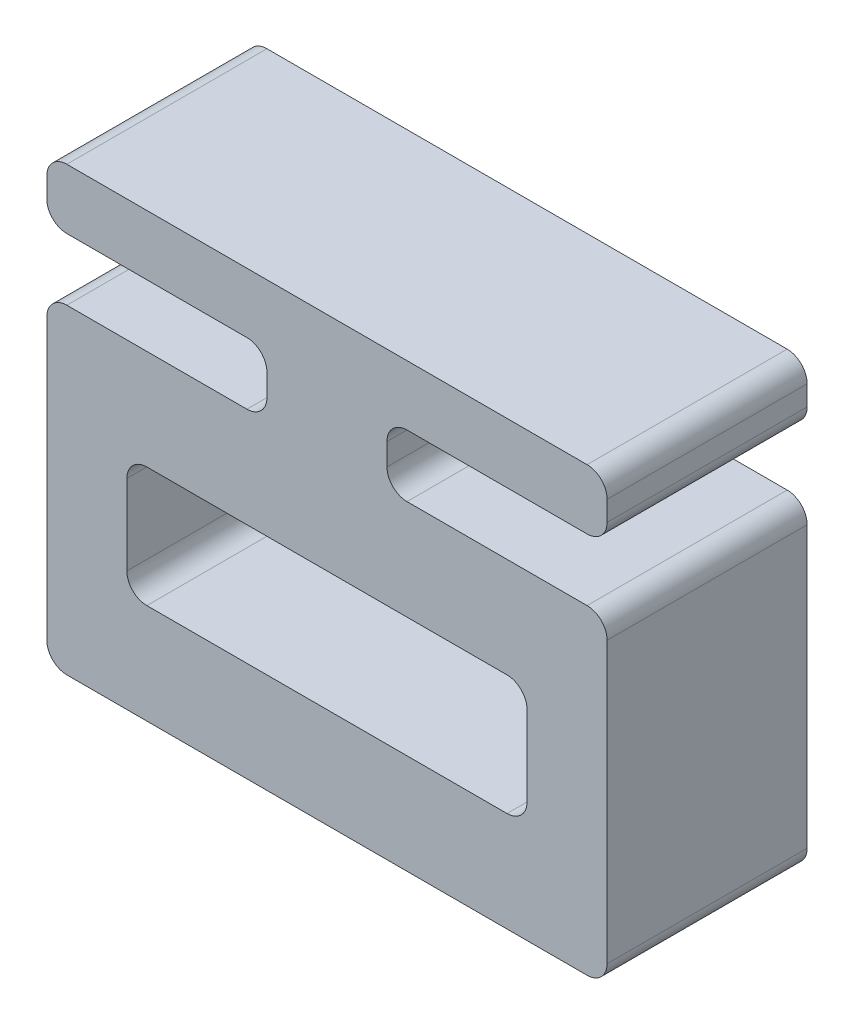
ISO-10303-21;
HEADER;
FILE_DESCRIPTION(('STEP AP214'),'2;1');
FILE_NAME('part.step','',(''),(''),'','','');
FILE_SCHEMA(('AUTOMOTIVE_DESIGN { 1 0 10303 214 1 1 1 1 }'));
ENDSEC;
DATA;
#1=APPLICATION_CONTEXT('core data for automotive mechanical design processes');
#2=APPLICATION_PROTOCOL_DEFINITION('international standard','automotive_design',2000,#1);
#3=PRODUCT_CONTEXT('',#1,'mechanical');
#4=PRODUCT('Part','Part','',(#3));
#5=PRODUCT_RELATED_PRODUCT_CATEGORY('part','',(#4));
#6=PRODUCT_DEFINITION_FORMATION('','',#4);
#7=PRODUCT_DEFINITION_CONTEXT('part definition',#1,'design');
#8=PRODUCT_DEFINITION('design','',#6,#7);
#9=PRODUCT_DEFINITION_SHAPE('','',#8);
#10=(LENGTH_UNIT() NAMED_UNIT(*) SI_UNIT(.MILLI.,.METRE.));
#11=(NAMED_UNIT(*) PLANE_ANGLE_UNIT() SI_UNIT($,.RADIAN.));
#12=(NAMED_UNIT(*) SI_UNIT($,.STERADIAN.) SOLID_ANGLE_UNIT());
#13=UNCERTAINTY_MEASURE_WITH_UNIT(LENGTH_MEASURE(1.E-05),#10,'distance_accuracy_value','');
#14=(GEOMETRIC_REPRESENTATION_CONTEXT(3) GLOBAL_UNCERTAINTY_ASSIGNED_CONTEXT((#13)) GLOBAL_UNIT_ASSIGNED_CONTEXT((#10,
#11,#12)) REPRESENTATION_CONTEXT('',''));
#15=CARTESIAN_POINT('',(0.,0.,0.));
#16=DIRECTION('',(0.,0.,1.));
#17=DIRECTION('',(1.,0.,0.));
#18=AXIS2_PLACEMENT_3D('',#15,#16,#17);
#19=CARTESIAN_POINT('',(0.,0.,5.));
#20=DIRECTION('',(0.,0.,-1.));
#21=DIRECTION('',(-1.,0.,0.));
#22=AXIS2_PLACEMENT_3D('',#19,#20,#21);
#23=PLANE('',#22);
#24=DIRECTION('',(0.,-1.,0.));
#25=VECTOR('',#24,1.);
#26=CARTESIAN_POINT('',(-7.,-4.,5.));
#27=LINE('',#26,#25);
#28=CARTESIAN_POINT('',(-7.,3.5,5.));
#29=VERTEX_POINT('',#28);
#30=CARTESIAN_POINT('',(-7.,-3.5,5.));
#31=VERTEX_POINT('',#30);
#32=EDGE_CURVE('E312',#29,#31,#27,.T.);
#33=ORIENTED_EDGE('',*,*,#32,.T.);
#34=CARTESIAN_POINT('',(-6.5,-3.5,5.));
#35=DIRECTION('',(0.,0.,-1.));
#36=DIRECTION('',(-1.,0.,0.));
#37=AXIS2_PLACEMENT_3D('',#34,#35,#36);
#38=CIRCLE('',#37,0.5);
#39=CARTESIAN_POINT('',(-6.5,-4.,5.));
#40=VERTEX_POINT('',#39);
#41=EDGE_CURVE('E351',#31,#40,#38,.F.);
#42=ORIENTED_EDGE('',*,*,#41,.T.);
#43=DIRECTION('',(1.,0.,0.));
#44=VECTOR('',#43,1.);
#45=CARTESIAN_POINT('',(-7.,-4.,5.));
#46=LINE('',#45,#44);
#47=CARTESIAN_POINT('',(6.5,-4.,5.));
#48=VERTEX_POINT('',#47);
#49=EDGE_CURVE('E269',#40,#48,#46,.T.);
#50=ORIENTED_EDGE('',*,*,#49,.T.);
#51=CARTESIAN_POINT('',(6.5,-3.5,5.));
#52=DIRECTION('',(0.,0.,-1.));
#53=DIRECTION('',(-1.,0.,0.));
#54=AXIS2_PLACEMENT_3D('',#51,#52,#53);
#55=CIRCLE('',#54,0.5);
#56=CARTESIAN_POINT('',(7.,-3.5,5.));
#57=VERTEX_POINT('',#56);
#58=EDGE_CURVE('E348',#48,#57,#55,.F.);
#59=ORIENTED_EDGE('',*,*,#58,.T.);
#60=DIRECTION('',(0.,1.,0.));
#61=VECTOR('',#60,1.);
#62=CARTESIAN_POINT('',(7.,-4.,5.));
#63=LINE('',#62,#61);
#64=CARTESIAN_POINT('',(7.,3.5,5.));
#65=VERTEX_POINT('',#64);
#66=EDGE_CURVE('E530',#57,#65,#63,.T.);
#67=ORIENTED_EDGE('',*,*,#66,.T.);
#68=CARTESIAN_POINT('',(6.5,3.5,5.));
#69=DIRECTION('',(0.,0.,-1.));
#70=DIRECTION('',(-1.,0.,0.));
#71=AXIS2_PLACEMENT_3D('',#68,#69,#70);
#72=CIRCLE('',#71,0.5);
#73=CARTESIAN_POINT('',(6.5,4.,5.));
#74=VERTEX_POINT('',#73);
#75=EDGE_CURVE('E330',#65,#74,#72,.F.);
#76=ORIENTED_EDGE('',*,*,#75,.T.);
#77=DIRECTION('',(-1.,0.,0.));
#78=VECTOR('',#77,1.);
#79=CARTESIAN_POINT('',(7.,4.,5.));
#80=LINE('',#79,#78);
#81=CARTESIAN_POINT('',(2.,4.,5.));
#82=VERTEX_POINT('',#81);
#83=EDGE_CURVE('E445',#74,#82,#80,.T.);
#84=ORIENTED_EDGE('',*,*,#83,.T.);
#85=CARTESIAN_POINT('',(2.,4.5,5.));
#86=DIRECTION('',(0.,0.,-1.));
#87=DIRECTION('',(-1.,0.,0.));
#88=AXIS2_PLACEMENT_3D('',#85,#86,#87);
#89=CIRCLE('',#88,0.5);
#90=CARTESIAN_POINT('',(1.5,4.5,5.));
#91=VERTEX_POINT('',#90);
#92=EDGE_CURVE('E425',#82,#91,#89,.T.);
#93=ORIENTED_EDGE('',*,*,#92,.T.);
#94=DIRECTION('',(0.,1.,0.));
#95=VECTOR('',#94,1.);
#96=CARTESIAN_POINT('',(1.5,5.55,5.));
#97=LINE('',#96,#95);
#98=CARTESIAN_POINT('',(1.5,5.05,5.));
#99=VERTEX_POINT('',#98);
#100=EDGE_CURVE('E439',#91,#99,#97,.T.);
#101=ORIENTED_EDGE('',*,*,#100,.T.);
#102=CARTESIAN_POINT('',(2.,5.05,5.));
#103=DIRECTION('',(0.,0.,-1.));
#104=DIRECTION('',(-1.,0.,0.));
#105=AXIS2_PLACEMENT_3D('',#102,#103,#104);
#106=CIRCLE('',#105,0.5);
#107=CARTESIAN_POINT('',(2.,5.55,5.));
#108=VERTEX_POINT('',#107);
#109=EDGE_CURVE('E563',#99,#108,#106,.T.);
#110=ORIENTED_EDGE('',*,*,#109,.T.);
#111=DIRECTION('',(1.,0.,0.));
#112=VECTOR('',#111,1.);
#113=CARTESIAN_POINT('',(7.,5.55,5.));
#114=LINE('',#113,#112);
#115=CARTESIAN_POINT('',(6.5,5.55,5.));
#116=VERTEX_POINT('',#115);
#117=EDGE_CURVE('E444',#108,#116,#114,.T.);
#118=ORIENTED_EDGE('',*,*,#117,.T.);
#119=CARTESIAN_POINT('',(6.5,6.05,5.));
#120=DIRECTION('',(0.,0.,-1.));
#121=DIRECTION('',(-1.,0.,0.));
#122=AXIS2_PLACEMENT_3D('',#119,#120,#121);
#123=CIRCLE('',#122,0.5);
#124=CARTESIAN_POINT('',(7.,6.05,5.));
#125=VERTEX_POINT('',#124);
#126=EDGE_CURVE('E339',#116,#125,#123,.F.);
#127=ORIENTED_EDGE('',*,*,#126,.T.);
#128=DIRECTION('',(0.,1.,0.));
#129=VECTOR('',#128,1.);
#130=CARTESIAN_POINT('',(7.,5.55,5.));
#131=LINE('',#130,#129);
#132=CARTESIAN_POINT('',(7.,6.55,5.));
#133=VERTEX_POINT('',#132);
#134=EDGE_CURVE('E452',#125,#133,#131,.T.);
#135=ORIENTED_EDGE('',*,*,#134,.T.);
#136=CARTESIAN_POINT('',(6.5,6.55,5.));
#137=DIRECTION('',(0.,0.,-1.));
#138=DIRECTION('',(-1.,0.,0.));
#139=AXIS2_PLACEMENT_3D('',#136,#137,#138);
#140=CIRCLE('',#139,0.5);
#141=CARTESIAN_POINT('',(6.5,7.05,5.));
#142=VERTEX_POINT('',#141);
#143=EDGE_CURVE('E342',#133,#142,#140,.F.);
#144=ORIENTED_EDGE('',*,*,#143,.T.);
#145=DIRECTION('',(-1.,0.,0.));
#146=VECTOR('',#145,1.);
#147=CARTESIAN_POINT('',(-7.,7.05,5.));
#148=LINE('',#147,#146);
#149=CARTESIAN_POINT('',(-6.5,7.05,5.));
#150=VERTEX_POINT('',#149);
#151=EDGE_CURVE('E460',#142,#150,#148,.T.);
#152=ORIENTED_EDGE('',*,*,#151,.T.);
#153=CARTESIAN_POINT('',(-6.5,6.55,5.));
#154=DIRECTION('',(0.,0.,-1.));
#155=DIRECTION('',(-1.,0.,0.));
#156=AXIS2_PLACEMENT_3D('',#153,#154,#155);
#157=CIRCLE('',#156,0.5);
#158=CARTESIAN_POINT('',(-7.,6.55,5.));
#159=VERTEX_POINT('',#158);
#160=EDGE_CURVE('E345',#150,#159,#157,.F.);
#161=ORIENTED_EDGE('',*,*,#160,.T.);
#162=DIRECTION('',(0.,-1.,0.));
#163=VECTOR('',#162,1.);
#164=CARTESIAN_POINT('',(-7.,5.55,5.));
#165=LINE('',#164,#163);
#166=CARTESIAN_POINT('',(-7.,6.05,5.));
#167=VERTEX_POINT('',#166);
#168=EDGE_CURVE('E464',#159,#167,#165,.T.);
#169=ORIENTED_EDGE('',*,*,#168,.T.);
#170=CARTESIAN_POINT('',(-6.5,6.05,5.));
#171=DIRECTION('',(0.,0.,-1.));
#172=DIRECTION('',(-1.,0.,0.));
#173=AXIS2_PLACEMENT_3D('',#170,#171,#172);
#174=CIRCLE('',#173,0.5);
#175=CARTESIAN_POINT('',(-6.5,5.55,5.));
#176=VERTEX_POINT('',#175);
#177=EDGE_CURVE('E336',#167,#176,#174,.F.);
#178=ORIENTED_EDGE('',*,*,#177,.T.);
#179=DIRECTION('',(1.,0.,0.));
#180=VECTOR('',#179,1.);
#181=CARTESIAN_POINT('',(-7.,5.55,5.));
#182=LINE('',#181,#180);
#183=CARTESIAN_POINT('',(-2.,5.55,5.));
#184=VERTEX_POINT('',#183);
#185=EDGE_CURVE('E469',#176,#184,#182,.T.);
#186=ORIENTED_EDGE('',*,*,#185,.T.);
#187=CARTESIAN_POINT('',(-2.,5.05,5.));
#188=DIRECTION('',(0.,0.,-1.));
#189=DIRECTION('',(-1.,0.,0.));
#190=AXIS2_PLACEMENT_3D('',#187,#188,#189);
#191=CIRCLE('',#190,0.5);
#192=CARTESIAN_POINT('',(-1.5,5.05,5.));
#193=VERTEX_POINT('',#192);
#194=EDGE_CURVE('E480',#184,#193,#191,.T.);
#195=ORIENTED_EDGE('',*,*,#194,.T.);
#196=DIRECTION('',(0.,-1.,0.));
#197=VECTOR('',#196,1.);
#198=CARTESIAN_POINT('',(-1.5,5.55,5.));
#199=LINE('',#198,#197);
#200=CARTESIAN_POINT('',(-1.5,4.5,5.));
#201=VERTEX_POINT('',#200);
#202=EDGE_CURVE('E474',#193,#201,#199,.T.);
#203=ORIENTED_EDGE('',*,*,#202,.T.);
#204=CARTESIAN_POINT('',(-2.,4.5,5.));
#205=DIRECTION('',(0.,0.,-1.));
#206=DIRECTION('',(-1.,0.,0.));
#207=AXIS2_PLACEMENT_3D('',#204,#205,#206);
#208=CIRCLE('',#207,0.5);
#209=CARTESIAN_POINT('',(-2.,4.,5.));
#210=VERTEX_POINT('',#209);
#211=EDGE_CURVE('E488',#201,#210,#208,.T.);
#212=ORIENTED_EDGE('',*,*,#211,.T.);
#213=DIRECTION('',(-1.,0.,0.));
#214=VECTOR('',#213,1.);
#215=CARTESIAN_POINT('',(-7.,4.,5.));
#216=LINE('',#215,#214);
#217=CARTESIAN_POINT('',(-6.5,4.,5.));
#218=VERTEX_POINT('',#217);
#219=EDGE_CURVE('E313',#210,#218,#216,.T.);
#220=ORIENTED_EDGE('',*,*,#219,.T.);
#221=CARTESIAN_POINT('',(-6.5,3.5,5.));
#222=DIRECTION('',(0.,0.,-1.));
#223=DIRECTION('',(-1.,0.,0.));
#224=AXIS2_PLACEMENT_3D('',#221,#222,#223);
#225=CIRCLE('',#224,0.5);
#226=EDGE_CURVE('E333',#218,#29,#225,.F.);
#227=ORIENTED_EDGE('',*,*,#226,.T.);
#228=EDGE_LOOP('',(#33,#42,#50,#59,#67,#76,#84,#93,#101,#110,#118,#127,#135,#144,#152,#161,#169,
#178,#186,#195,#203,#212,#220,#227));
#229=FACE_BOUND('',#228,.T.);
#230=DIRECTION('',(0.,-1.,0.));
#231=VECTOR('',#230,1.);
#232=CARTESIAN_POINT('',(-5.,-1.5,5.));
#233=LINE('',#232,#231);
#234=CARTESIAN_POINT('',(-5.,1.,5.));
#235=VERTEX_POINT('',#234);
#236=CARTESIAN_POINT('',(-5.,-1.,5.));
#237=VERTEX_POINT('',#236);
#238=EDGE_CURVE('E618',#235,#237,#233,.T.);
#239=ORIENTED_EDGE('',*,*,#238,.F.);
#240=CARTESIAN_POINT('',(-4.5,1.,5.));
#241=DIRECTION('',(0.,0.,-1.));
#242=DIRECTION('',(-1.,0.,0.));
#243=AXIS2_PLACEMENT_3D('',#240,#241,#242);
#244=CIRCLE('',#243,0.5);
#245=CARTESIAN_POINT('',(-4.5,1.5,5.));
#246=VERTEX_POINT('',#245);
#247=EDGE_CURVE('E632',#235,#246,#244,.T.);
#248=ORIENTED_EDGE('',*,*,#247,.T.);
#249=DIRECTION('',(-1.,0.,0.));
#250=VECTOR('',#249,1.);
#251=CARTESIAN_POINT('',(-5.,1.5,5.));
#252=LINE('',#251,#250);
#253=CARTESIAN_POINT('',(4.5,1.5,5.));
#254=VERTEX_POINT('',#253);
#255=EDGE_CURVE('E282',#254,#246,#252,.T.);
#256=ORIENTED_EDGE('',*,*,#255,.F.);
#257=CARTESIAN_POINT('',(4.5,1.,5.));
#258=DIRECTION('',(0.,0.,-1.));
#259=DIRECTION('',(-1.,0.,0.));
#260=AXIS2_PLACEMENT_3D('',#257,#258,#259);
#261=CIRCLE('',#260,0.5);
#262=CARTESIAN_POINT('',(5.,1.,5.));
#263=VERTEX_POINT('',#262);
#264=EDGE_CURVE('E625',#254,#263,#261,.T.);
#265=ORIENTED_EDGE('',*,*,#264,.T.);
#266=DIRECTION('',(0.,1.,0.));
#267=VECTOR('',#266,1.);
#268=CARTESIAN_POINT('',(5.,-1.5,5.));
#269=LINE('',#268,#267);
#270=CARTESIAN_POINT('',(5.,-1.,5.));
#271=VERTEX_POINT('',#270);
#272=EDGE_CURVE('E643',#271,#263,#269,.T.);
#273=ORIENTED_EDGE('',*,*,#272,.F.);
#274=CARTESIAN_POINT('',(4.5,-1.,5.));
#275=DIRECTION('',(0.,0.,-1.));
#276=DIRECTION('',(-1.,0.,0.));
#277=AXIS2_PLACEMENT_3D('',#274,#275,#276);
#278=CIRCLE('',#277,0.5);
#279=CARTESIAN_POINT('',(4.5,-1.5,5.));
#280=VERTEX_POINT('',#279);
#281=EDGE_CURVE('E54',#271,#280,#278,.T.);
#282=ORIENTED_EDGE('',*,*,#281,.T.);
#283=DIRECTION('',(1.,0.,0.));
#284=VECTOR('',#283,1.);
#285=CARTESIAN_POINT('',(-5.,-1.5,5.));
#286=LINE('',#285,#284);
#287=CARTESIAN_POINT('',(-4.5,-1.5,5.));
#288=VERTEX_POINT('',#287);
#289=EDGE_CURVE('E646',#288,#280,#286,.T.);
#290=ORIENTED_EDGE('',*,*,#289,.F.);
#291=CARTESIAN_POINT('',(-4.5,-1.,5.));
#292=DIRECTION('',(0.,0.,-1.));
#293=DIRECTION('',(-1.,0.,0.));
#294=AXIS2_PLACEMENT_3D('',#291,#292,#293);
#295=CIRCLE('',#294,0.5);
#296=EDGE_CURVE('E12',#288,#237,#295,.T.);
#297=ORIENTED_EDGE('',*,*,#296,.T.);
#298=EDGE_LOOP('',(#239,#248,#256,#265,#273,#282,#290,#297));
#299=FACE_BOUND('',#298,.T.);
#300=ADVANCED_FACE('F37',(#229,#299),#23,.F.);
#301=CARTESIAN_POINT('',(0.,0.,0.));
#302=DIRECTION('',(0.,0.,-1.));
#303=DIRECTION('',(-1.,0.,0.));
#304=AXIS2_PLACEMENT_3D('',#301,#302,#303);
#305=PLANE('',#304);
#306=DIRECTION('',(1.,0.,0.));
#307=VECTOR('',#306,1.);
#308=CARTESIAN_POINT('',(-7.,-4.,0.));
#309=LINE('',#308,#307);
#310=CARTESIAN_POINT('',(-6.5,-4.,0.));
#311=VERTEX_POINT('',#310);
#312=CARTESIAN_POINT('',(6.5,-4.,0.));
#313=VERTEX_POINT('',#312);
#314=EDGE_CURVE('E266',#311,#313,#309,.T.);
#315=ORIENTED_EDGE('',*,*,#314,.F.);
#316=CARTESIAN_POINT('',(-6.5,-3.5,0.));
#317=DIRECTION('',(0.,0.,-1.));
#318=DIRECTION('',(-1.,0.,0.));
#319=AXIS2_PLACEMENT_3D('',#316,#317,#318);
#320=CIRCLE('',#319,0.5);
#321=CARTESIAN_POINT('',(-7.,-3.5,0.));
#322=VERTEX_POINT('',#321);
#323=EDGE_CURVE('E249',#311,#322,#320,.T.);
#324=ORIENTED_EDGE('',*,*,#323,.T.);
#325=DIRECTION('',(0.,-1.,0.));
#326=VECTOR('',#325,1.);
#327=CARTESIAN_POINT('',(-7.,-4.,0.));
#328=LINE('',#327,#326);
#329=CARTESIAN_POINT('',(-7.,3.5,0.));
#330=VERTEX_POINT('',#329);
#331=EDGE_CURVE('E277',#330,#322,#328,.T.);
#332=ORIENTED_EDGE('',*,*,#331,.F.);
#333=CARTESIAN_POINT('',(-6.5,3.5,0.));
#334=DIRECTION('',(0.,0.,-1.));
#335=DIRECTION('',(-1.,0.,0.));
#336=AXIS2_PLACEMENT_3D('',#333,#334,#335);
#337=CIRCLE('',#336,0.5);
#338=CARTESIAN_POINT('',(-6.5,4.,0.));
#339=VERTEX_POINT('',#338);
#340=EDGE_CURVE('E316',#330,#339,#337,.T.);
#341=ORIENTED_EDGE('',*,*,#340,.T.);
#342=DIRECTION('',(-1.,0.,0.));
#343=VECTOR('',#342,1.);
#344=CARTESIAN_POINT('',(-7.,4.,0.));
#345=LINE('',#344,#343);
#346=CARTESIAN_POINT('',(-2.,4.,0.));
#347=VERTEX_POINT('',#346);
#348=EDGE_CURVE('E309',#347,#339,#345,.T.);
#349=ORIENTED_EDGE('',*,*,#348,.F.);
#350=CARTESIAN_POINT('',(-2.,4.5,0.));
#351=DIRECTION('',(0.,0.,-1.));
#352=DIRECTION('',(-1.,0.,0.));
#353=AXIS2_PLACEMENT_3D('',#350,#351,#352);
#354=CIRCLE('',#353,0.5);
#355=CARTESIAN_POINT('',(-1.5,4.5,0.));
#356=VERTEX_POINT('',#355);
#357=EDGE_CURVE('E485',#347,#356,#354,.F.);
#358=ORIENTED_EDGE('',*,*,#357,.T.);
#359=DIRECTION('',(0.,-1.,0.));
#360=VECTOR('',#359,1.);
#361=CARTESIAN_POINT('',(-1.5,5.55,0.));
#362=LINE('',#361,#360);
#363=CARTESIAN_POINT('',(-1.5,5.05,0.));
#364=VERTEX_POINT('',#363);
#365=EDGE_CURVE('E306',#364,#356,#362,.T.);
#366=ORIENTED_EDGE('',*,*,#365,.F.);
#367=CARTESIAN_POINT('',(-2.,5.05,0.));
#368=DIRECTION('',(0.,0.,-1.));
#369=DIRECTION('',(-1.,0.,0.));
#370=AXIS2_PLACEMENT_3D('',#367,#368,#369);
#371=CIRCLE('',#370,0.5);
#372=CARTESIAN_POINT('',(-2.,5.55,0.));
#373=VERTEX_POINT('',#372);
#374=EDGE_CURVE('E486',#364,#373,#371,.F.);
#375=ORIENTED_EDGE('',*,*,#374,.T.);
#376=DIRECTION('',(1.,0.,0.));
#377=VECTOR('',#376,1.);
#378=CARTESIAN_POINT('',(-7.,5.55,0.));
#379=LINE('',#378,#377);
#380=CARTESIAN_POINT('',(-6.5,5.55,0.));
#381=VERTEX_POINT('',#380);
#382=EDGE_CURVE('E303',#381,#373,#379,.T.);
#383=ORIENTED_EDGE('',*,*,#382,.F.);
#384=CARTESIAN_POINT('',(-6.5,6.05,0.));
#385=DIRECTION('',(0.,0.,-1.));
#386=DIRECTION('',(-1.,0.,0.));
#387=AXIS2_PLACEMENT_3D('',#384,#385,#386);
#388=CIRCLE('',#387,0.5);
#389=CARTESIAN_POINT('',(-7.,6.05,0.));
#390=VERTEX_POINT('',#389);
#391=EDGE_CURVE('E318',#381,#390,#388,.T.);
#392=ORIENTED_EDGE('',*,*,#391,.T.);
#393=DIRECTION('',(0.,-1.,0.));
#394=VECTOR('',#393,1.);
#395=CARTESIAN_POINT('',(-7.,5.55,0.));
#396=LINE('',#395,#394);
#397=CARTESIAN_POINT('',(-7.,6.55,0.));
#398=VERTEX_POINT('',#397);
#399=EDGE_CURVE('E300',#398,#390,#396,.T.);
#400=ORIENTED_EDGE('',*,*,#399,.F.);
#401=CARTESIAN_POINT('',(-6.5,6.55,0.));
#402=DIRECTION('',(0.,0.,-1.));
#403=DIRECTION('',(-1.,0.,0.));
#404=AXIS2_PLACEMENT_3D('',#401,#402,#403);
#405=CIRCLE('',#404,0.5);
#406=CARTESIAN_POINT('',(-6.5,7.05,0.));
#407=VERTEX_POINT('',#406);
#408=EDGE_CURVE('E324',#398,#407,#405,.T.);
#409=ORIENTED_EDGE('',*,*,#408,.T.);
#410=DIRECTION('',(-1.,0.,0.));
#411=VECTOR('',#410,1.);
#412=CARTESIAN_POINT('',(-7.,7.05,0.));
#413=LINE('',#412,#411);
#414=CARTESIAN_POINT('',(6.5,7.05,0.));
#415=VERTEX_POINT('',#414);
#416=EDGE_CURVE('E297',#415,#407,#413,.T.);
#417=ORIENTED_EDGE('',*,*,#416,.F.);
#418=CARTESIAN_POINT('',(6.5,6.55,0.));
#419=DIRECTION('',(0.,0.,-1.));
#420=DIRECTION('',(-1.,0.,0.));
#421=AXIS2_PLACEMENT_3D('',#418,#419,#420);
#422=CIRCLE('',#421,0.5);
#423=CARTESIAN_POINT('',(7.,6.55,0.));
#424=VERTEX_POINT('',#423);
#425=EDGE_CURVE('E322',#415,#424,#422,.T.);
#426=ORIENTED_EDGE('',*,*,#425,.T.);
#427=DIRECTION('',(0.,1.,0.));
#428=VECTOR('',#427,1.);
#429=CARTESIAN_POINT('',(7.,5.55,0.));
#430=LINE('',#429,#428);
#431=CARTESIAN_POINT('',(7.,6.05,0.));
#432=VERTEX_POINT('',#431);
#433=EDGE_CURVE('E294',#432,#424,#430,.T.);
#434=ORIENTED_EDGE('',*,*,#433,.F.);
#435=CARTESIAN_POINT('',(6.5,6.05,0.));
#436=DIRECTION('',(0.,0.,-1.));
#437=DIRECTION('',(-1.,0.,0.));
#438=AXIS2_PLACEMENT_3D('',#435,#436,#437);
#439=CIRCLE('',#438,0.5);
#440=CARTESIAN_POINT('',(6.5,5.55,0.));
#441=VERTEX_POINT('',#440);
#442=EDGE_CURVE('E320',#432,#441,#439,.T.);
#443=ORIENTED_EDGE('',*,*,#442,.T.);
#444=DIRECTION('',(1.,0.,0.));
#445=VECTOR('',#444,1.);
#446=CARTESIAN_POINT('',(7.,5.55,0.));
#447=LINE('',#446,#445);
#448=CARTESIAN_POINT('',(2.,5.55,0.));
#449=VERTEX_POINT('',#448);
#450=EDGE_CURVE('E291',#449,#441,#447,.T.);
#451=ORIENTED_EDGE('',*,*,#450,.F.);
#452=CARTESIAN_POINT('',(2.,5.05,0.));
#453=DIRECTION('',(0.,0.,-1.));
#454=DIRECTION('',(-1.,0.,0.));
#455=AXIS2_PLACEMENT_3D('',#452,#453,#454);
#456=CIRCLE('',#455,0.5);
#457=CARTESIAN_POINT('',(1.5,5.05,0.));
#458=VERTEX_POINT('',#457);
#459=EDGE_CURVE('E429',#449,#458,#456,.F.);
#460=ORIENTED_EDGE('',*,*,#459,.T.);
#461=DIRECTION('',(0.,1.,0.));
#462=VECTOR('',#461,1.);
#463=CARTESIAN_POINT('',(1.5,5.55,0.));
#464=LINE('',#463,#462);
#465=CARTESIAN_POINT('',(1.5,4.5,0.));
#466=VERTEX_POINT('',#465);
#467=EDGE_CURVE('E288',#466,#458,#464,.T.);
#468=ORIENTED_EDGE('',*,*,#467,.F.);
#469=CARTESIAN_POINT('',(2.,4.5,0.));
#470=DIRECTION('',(0.,0.,-1.));
#471=DIRECTION('',(-1.,0.,0.));
#472=AXIS2_PLACEMENT_3D('',#469,#470,#471);
#473=CIRCLE('',#472,0.5);
#474=CARTESIAN_POINT('',(2.,4.,0.));
#475=VERTEX_POINT('',#474);
#476=EDGE_CURVE('E423',#466,#475,#473,.F.);
#477=ORIENTED_EDGE('',*,*,#476,.T.);
#478=DIRECTION('',(-1.,0.,0.));
#479=VECTOR('',#478,1.);
#480=CARTESIAN_POINT('',(7.,4.,0.));
#481=LINE('',#480,#479);
#482=CARTESIAN_POINT('',(6.5,4.,0.));
#483=VERTEX_POINT('',#482);
#484=EDGE_CURVE('E280',#483,#475,#481,.T.);
#485=ORIENTED_EDGE('',*,*,#484,.F.);
#486=CARTESIAN_POINT('',(6.5,3.5,0.));
#487=DIRECTION('',(0.,0.,-1.));
#488=DIRECTION('',(-1.,0.,0.));
#489=AXIS2_PLACEMENT_3D('',#486,#487,#488);
#490=CIRCLE('',#489,0.5);
#491=CARTESIAN_POINT('',(7.,3.5,0.));
#492=VERTEX_POINT('',#491);
#493=EDGE_CURVE('E270',#483,#492,#490,.T.);
#494=ORIENTED_EDGE('',*,*,#493,.T.);
#495=DIRECTION('',(0.,1.,0.));
#496=VECTOR('',#495,1.);
#497=CARTESIAN_POINT('',(7.,-4.,0.));
#498=LINE('',#497,#496);
#499=CARTESIAN_POINT('',(7.,-3.5,0.));
#500=VERTEX_POINT('',#499);
#501=EDGE_CURVE('E276',#500,#492,#498,.T.);
#502=ORIENTED_EDGE('',*,*,#501,.F.);
#503=CARTESIAN_POINT('',(6.5,-3.5,0.));
#504=DIRECTION('',(0.,0.,-1.));
#505=DIRECTION('',(-1.,0.,0.));
#506=AXIS2_PLACEMENT_3D('',#503,#504,#505);
#507=CIRCLE('',#506,0.5);
#508=EDGE_CURVE('E260',#500,#313,#507,.T.);
#509=ORIENTED_EDGE('',*,*,#508,.T.);
#510=EDGE_LOOP('',(#315,#324,#332,#341,#349,#358,#366,#375,#383,#392,#400,#409,#417,#426,#434,
#443,#451,#460,#468,#477,#485,#494,#502,#509));
#511=FACE_BOUND('',#510,.T.);
#512=DIRECTION('',(0.,1.,0.));
#513=VECTOR('',#512,1.);
#514=CARTESIAN_POINT('',(5.,-1.5,0.));
#515=LINE('',#514,#513);
#516=CARTESIAN_POINT('',(5.,-1.,0.));
#517=VERTEX_POINT('',#516);
#518=CARTESIAN_POINT('',(5.,1.,0.));
#519=VERTEX_POINT('',#518);
#520=EDGE_CURVE('E619',#517,#519,#515,.T.);
#521=ORIENTED_EDGE('',*,*,#520,.T.);
#522=CARTESIAN_POINT('',(4.5,1.,0.));
#523=DIRECTION('',(0.,0.,-1.));
#524=DIRECTION('',(-1.,0.,0.));
#525=AXIS2_PLACEMENT_3D('',#522,#523,#524);
#526=CIRCLE('',#525,0.5);
#527=CARTESIAN_POINT('',(4.5,1.5,0.));
#528=VERTEX_POINT('',#527);
#529=EDGE_CURVE('E624',#519,#528,#526,.F.);
#530=ORIENTED_EDGE('',*,*,#529,.T.);
#531=DIRECTION('',(-1.,0.,0.));
#532=VECTOR('',#531,1.);
#533=CARTESIAN_POINT('',(-5.,1.5,0.));
#534=LINE('',#533,#532);
#535=CARTESIAN_POINT('',(-4.5,1.5,0.));
#536=VERTEX_POINT('',#535);
#537=EDGE_CURVE('E534',#528,#536,#534,.T.);
#538=ORIENTED_EDGE('',*,*,#537,.T.);
#539=CARTESIAN_POINT('',(-4.5,1.,0.));
#540=DIRECTION('',(0.,0.,-1.));
#541=DIRECTION('',(-1.,0.,0.));
#542=AXIS2_PLACEMENT_3D('',#539,#540,#541);
#543=CIRCLE('',#542,0.5);
#544=CARTESIAN_POINT('',(-5.,1.,0.));
#545=VERTEX_POINT('',#544);
#546=EDGE_CURVE('E628',#536,#545,#543,.F.);
#547=ORIENTED_EDGE('',*,*,#546,.T.);
#548=DIRECTION('',(0.,-1.,0.));
#549=VECTOR('',#548,1.);
#550=CARTESIAN_POINT('',(-5.,-1.5,0.));
#551=LINE('',#550,#549);
#552=CARTESIAN_POINT('',(-5.,-1.,0.));
#553=VERTEX_POINT('',#552);
#554=EDGE_CURVE('E650',#545,#553,#551,.T.);
#555=ORIENTED_EDGE('',*,*,#554,.T.);
#556=CARTESIAN_POINT('',(-4.5,-1.,0.));
#557=DIRECTION('',(0.,0.,-1.));
#558=DIRECTION('',(-1.,0.,0.));
#559=AXIS2_PLACEMENT_3D('',#556,#557,#558);
#560=CIRCLE('',#559,0.5);
#561=CARTESIAN_POINT('',(-4.5,-1.5,0.));
#562=VERTEX_POINT('',#561);
#563=EDGE_CURVE('E47',#553,#562,#560,.F.);
#564=ORIENTED_EDGE('',*,*,#563,.T.);
#565=DIRECTION('',(1.,0.,0.));
#566=VECTOR('',#565,1.);
#567=CARTESIAN_POINT('',(-5.,-1.5,0.));
#568=LINE('',#567,#566);
#569=CARTESIAN_POINT('',(4.5,-1.5,0.));
#570=VERTEX_POINT('',#569);
#571=EDGE_CURVE('E653',#562,#570,#568,.T.);
#572=ORIENTED_EDGE('',*,*,#571,.T.);
#573=CARTESIAN_POINT('',(4.5,-1.,0.));
#574=DIRECTION('',(0.,0.,-1.));
#575=DIRECTION('',(-1.,0.,0.));
#576=AXIS2_PLACEMENT_3D('',#573,#574,#575);
#577=CIRCLE('',#576,0.5);
#578=EDGE_CURVE('E492',#570,#517,#577,.F.);
#579=ORIENTED_EDGE('',*,*,#578,.T.);
#580=EDGE_LOOP('',(#521,#530,#538,#547,#555,#564,#572,#579));
#581=FACE_BOUND('',#580,.T.);
#582=ADVANCED_FACE('F273',(#511,#581),#305,.T.);
#583=CARTESIAN_POINT('',(-7.,-4.,5.));
#584=DIRECTION('',(1.,0.,0.));
#585=DIRECTION('',(0.,0.,-1.));
#586=AXIS2_PLACEMENT_3D('',#583,#584,#585);
#587=PLANE('',#586);
#588=ORIENTED_EDGE('',*,*,#331,.T.);
#589=DIRECTION('',(0.,0.,-1.));
#590=VECTOR('',#589,1.);
#591=CARTESIAN_POINT('',(-7.,-3.5,5.));
#592=LINE('',#591,#590);
#593=EDGE_CURVE('E254',#322,#31,#592,.F.);
#594=ORIENTED_EDGE('',*,*,#593,.T.);
#595=ORIENTED_EDGE('',*,*,#32,.F.);
#596=DIRECTION('',(0.,0.,-1.));
#597=VECTOR('',#596,1.);
#598=CARTESIAN_POINT('',(-7.,3.5,5.));
#599=LINE('',#598,#597);
#600=EDGE_CURVE('E259',#29,#330,#599,.T.);
#601=ORIENTED_EDGE('',*,*,#600,.T.);
#602=EDGE_LOOP('',(#588,#594,#595,#601));
#603=FACE_BOUND('',#602,.T.);
#604=ADVANCED_FACE('F526',(#603),#587,.F.);
#605=CARTESIAN_POINT('',(-7.,-4.,5.));
#606=DIRECTION('',(0.,1.,0.));
#607=DIRECTION('',(-1.,0.,0.));
#608=AXIS2_PLACEMENT_3D('',#605,#606,#607);
#609=PLANE('',#608);
#610=ORIENTED_EDGE('',*,*,#49,.F.);
#611=DIRECTION('',(0.,0.,-1.));
#612=VECTOR('',#611,1.);
#613=CARTESIAN_POINT('',(-6.5,-4.,5.));
#614=LINE('',#613,#612);
#615=EDGE_CURVE('E253',#40,#311,#614,.T.);
#616=ORIENTED_EDGE('',*,*,#615,.T.);
#617=ORIENTED_EDGE('',*,*,#314,.T.);
#618=DIRECTION('',(0.,0.,-1.));
#619=VECTOR('',#618,1.);
#620=CARTESIAN_POINT('',(6.5,-4.,5.));
#621=LINE('',#620,#619);
#622=EDGE_CURVE('E271',#313,#48,#621,.F.);
#623=ORIENTED_EDGE('',*,*,#622,.T.);
#624=EDGE_LOOP('',(#610,#616,#617,#623));
#625=FACE_BOUND('',#624,.T.);
#626=ADVANCED_FACE('F265',(#625),#609,.F.);
#627=CARTESIAN_POINT('',(7.,-4.,5.));
#628=DIRECTION('',(-1.,0.,0.));
#629=DIRECTION('',(0.,-1.,0.));
#630=AXIS2_PLACEMENT_3D('',#627,#628,#629);
#631=PLANE('',#630);
#632=ORIENTED_EDGE('',*,*,#66,.F.);
#633=DIRECTION('',(0.,0.,-1.));
#634=VECTOR('',#633,1.);
#635=CARTESIAN_POINT('',(7.,-3.5,5.));
#636=LINE('',#635,#634);
#637=EDGE_CURVE('E356',#57,#500,#636,.T.);
#638=ORIENTED_EDGE('',*,*,#637,.T.);
#639=ORIENTED_EDGE('',*,*,#501,.T.);
#640=DIRECTION('',(0.,0.,-1.));
#641=VECTOR('',#640,1.);
#642=CARTESIAN_POINT('',(7.,3.5,5.));
#643=LINE('',#642,#641);
#644=EDGE_CURVE('E354',#492,#65,#643,.F.);
#645=ORIENTED_EDGE('',*,*,#644,.T.);
#646=EDGE_LOOP('',(#632,#638,#639,#645));
#647=FACE_BOUND('',#646,.T.);
#648=ADVANCED_FACE('F725',(#647),#631,.F.);
#649=CARTESIAN_POINT('',(7.,4.,5.));
#650=DIRECTION('',(0.,-1.,0.));
#651=DIRECTION('',(1.,0.,0.));
#652=AXIS2_PLACEMENT_3D('',#649,#650,#651);
#653=PLANE('',#652);
#654=ORIENTED_EDGE('',*,*,#83,.F.);
#655=DIRECTION('',(0.,0.,-1.));
#656=VECTOR('',#655,1.);
#657=CARTESIAN_POINT('',(6.5,4.,5.));
#658=LINE('',#657,#656);
#659=EDGE_CURVE('E391',#74,#483,#658,.T.);
#660=ORIENTED_EDGE('',*,*,#659,.T.);
#661=ORIENTED_EDGE('',*,*,#484,.T.);
#662=DIRECTION('',(0.,0.,-1.));
#663=VECTOR('',#662,1.);
#664=CARTESIAN_POINT('',(2.,4.,5.));
#665=LINE('',#664,#663);
#666=EDGE_CURVE('E389',#475,#82,#665,.F.);
#667=ORIENTED_EDGE('',*,*,#666,.T.);
#668=EDGE_LOOP('',(#654,#660,#661,#667));
#669=FACE_BOUND('',#668,.T.);
#670=ADVANCED_FACE('F728',(#669),#653,.F.);
#671=CARTESIAN_POINT('',(1.5,5.55,5.));
#672=DIRECTION('',(-1.,0.,0.));
#673=DIRECTION('',(0.,-1.,0.));
#674=AXIS2_PLACEMENT_3D('',#671,#672,#673);
#675=PLANE('',#674);
#676=ORIENTED_EDGE('',*,*,#100,.F.);
#677=DIRECTION('',(0.,0.,-1.));
#678=VECTOR('',#677,1.);
#679=CARTESIAN_POINT('',(1.5,4.5,0.));
#680=LINE('',#679,#678);
#681=EDGE_CURVE('E396',#91,#466,#680,.T.);
#682=ORIENTED_EDGE('',*,*,#681,.T.);
#683=ORIENTED_EDGE('',*,*,#467,.T.);
#684=DIRECTION('',(0.,0.,-1.));
#685=VECTOR('',#684,1.);
#686=CARTESIAN_POINT('',(1.5,5.05,5.));
#687=LINE('',#686,#685);
#688=EDGE_CURVE('E394',#458,#99,#687,.F.);
#689=ORIENTED_EDGE('',*,*,#688,.T.);
#690=EDGE_LOOP('',(#676,#682,#683,#689));
#691=FACE_BOUND('',#690,.T.);
#692=ADVANCED_FACE('F557',(#691),#675,.F.);
#693=CARTESIAN_POINT('',(7.,5.55,5.));
#694=DIRECTION('',(0.,1.,0.));
#695=DIRECTION('',(-1.,0.,0.));
#696=AXIS2_PLACEMENT_3D('',#693,#694,#695);
#697=PLANE('',#696);
#698=ORIENTED_EDGE('',*,*,#450,.T.);
#699=DIRECTION('',(0.,0.,-1.));
#700=VECTOR('',#699,1.);
#701=CARTESIAN_POINT('',(6.5,5.55,5.));
#702=LINE('',#701,#700);
#703=EDGE_CURVE('E377',#441,#116,#702,.F.);
#704=ORIENTED_EDGE('',*,*,#703,.T.);
#705=ORIENTED_EDGE('',*,*,#117,.F.);
#706=DIRECTION('',(0.,0.,-1.));
#707=VECTOR('',#706,1.);
#708=CARTESIAN_POINT('',(2.,5.55,0.));
#709=LINE('',#708,#707);
#710=EDGE_CURVE('E374',#108,#449,#709,.T.);
#711=ORIENTED_EDGE('',*,*,#710,.T.);
#712=EDGE_LOOP('',(#698,#704,#705,#711));
#713=FACE_BOUND('',#712,.T.);
#714=ADVANCED_FACE('F734',(#713),#697,.F.);
#715=CARTESIAN_POINT('',(7.,5.55,5.));
#716=DIRECTION('',(-1.,0.,0.));
#717=DIRECTION('',(0.,0.,1.));
#718=AXIS2_PLACEMENT_3D('',#715,#716,#717);
#719=PLANE('',#718);
#720=ORIENTED_EDGE('',*,*,#433,.T.);
#721=DIRECTION('',(0.,0.,-1.));
#722=VECTOR('',#721,1.);
#723=CARTESIAN_POINT('',(7.,6.55,5.));
#724=LINE('',#723,#722);
#725=EDGE_CURVE('E372',#424,#133,#724,.F.);
#726=ORIENTED_EDGE('',*,*,#725,.T.);
#727=ORIENTED_EDGE('',*,*,#134,.F.);
#728=DIRECTION('',(0.,0.,-1.));
#729=VECTOR('',#728,1.);
#730=CARTESIAN_POINT('',(7.,6.05,5.));
#731=LINE('',#730,#729);
#732=EDGE_CURVE('E369',#125,#432,#731,.T.);
#733=ORIENTED_EDGE('',*,*,#732,.T.);
#734=EDGE_LOOP('',(#720,#726,#727,#733));
#735=FACE_BOUND('',#734,.T.);
#736=ADVANCED_FACE('F737',(#735),#719,.F.);
#737=CARTESIAN_POINT('',(-7.,7.05,5.));
#738=DIRECTION('',(0.,-1.,0.));
#739=DIRECTION('',(1.,0.,0.));
#740=AXIS2_PLACEMENT_3D('',#737,#738,#739);
#741=PLANE('',#740);
#742=ORIENTED_EDGE('',*,*,#416,.T.);
#743=DIRECTION('',(0.,0.,-1.));
#744=VECTOR('',#743,1.);
#745=CARTESIAN_POINT('',(-6.5,7.05,5.));
#746=LINE('',#745,#744);
#747=EDGE_CURVE('E367',#407,#150,#746,.F.);
#748=ORIENTED_EDGE('',*,*,#747,.T.);
#749=ORIENTED_EDGE('',*,*,#151,.F.);
#750=DIRECTION('',(0.,0.,-1.));
#751=VECTOR('',#750,1.);
#752=CARTESIAN_POINT('',(6.5,7.05,5.));
#753=LINE('',#752,#751);
#754=EDGE_CURVE('E364',#142,#415,#753,.T.);
#755=ORIENTED_EDGE('',*,*,#754,.T.);
#756=EDGE_LOOP('',(#742,#748,#749,#755));
#757=FACE_BOUND('',#756,.T.);
#758=ADVANCED_FACE('F741',(#757),#741,.F.);
#759=CARTESIAN_POINT('',(-7.,5.55,5.));
#760=DIRECTION('',(1.,0.,0.));
#761=DIRECTION('',(0.,0.,-1.));
#762=AXIS2_PLACEMENT_3D('',#759,#760,#761);
#763=PLANE('',#762);
#764=ORIENTED_EDGE('',*,*,#168,.F.);
#765=DIRECTION('',(0.,0.,-1.));
#766=VECTOR('',#765,1.);
#767=CARTESIAN_POINT('',(-7.,6.55,5.));
#768=LINE('',#767,#766);
#769=EDGE_CURVE('E361',#159,#398,#768,.T.);
#770=ORIENTED_EDGE('',*,*,#769,.T.);
#771=ORIENTED_EDGE('',*,*,#399,.T.);
#772=DIRECTION('',(0.,0.,-1.));
#773=VECTOR('',#772,1.);
#774=CARTESIAN_POINT('',(-7.,6.05,5.));
#775=LINE('',#774,#773);
#776=EDGE_CURVE('E359',#390,#167,#775,.F.);
#777=ORIENTED_EDGE('',*,*,#776,.T.);
#778=EDGE_LOOP('',(#764,#770,#771,#777));
#779=FACE_BOUND('',#778,.T.);
#780=ADVANCED_FACE('F585',(#779),#763,.F.);
#781=CARTESIAN_POINT('',(-7.,5.55,5.));
#782=DIRECTION('',(0.,1.,0.));
#783=DIRECTION('',(0.,0.,1.));
#784=AXIS2_PLACEMENT_3D('',#781,#782,#783);
#785=PLANE('',#784);
#786=ORIENTED_EDGE('',*,*,#185,.F.);
#787=DIRECTION('',(0.,0.,-1.));
#788=VECTOR('',#787,1.);
#789=CARTESIAN_POINT('',(-6.5,5.55,5.));
#790=LINE('',#789,#788);
#791=EDGE_CURVE('E381',#176,#381,#790,.T.);
#792=ORIENTED_EDGE('',*,*,#791,.T.);
#793=ORIENTED_EDGE('',*,*,#382,.T.);
#794=DIRECTION('',(0.,0.,-1.));
#795=VECTOR('',#794,1.);
#796=CARTESIAN_POINT('',(-2.,5.55,5.));
#797=LINE('',#796,#795);
#798=EDGE_CURVE('E379',#373,#184,#797,.F.);
#799=ORIENTED_EDGE('',*,*,#798,.T.);
#800=EDGE_LOOP('',(#786,#792,#793,#799));
#801=FACE_BOUND('',#800,.T.);
#802=ADVANCED_FACE('F573',(#801),#785,.F.);
#803=CARTESIAN_POINT('',(-1.5,5.55,5.));
#804=DIRECTION('',(1.,0.,0.));
#805=DIRECTION('',(0.,1.,0.));
#806=AXIS2_PLACEMENT_3D('',#803,#804,#805);
#807=PLANE('',#806);
#808=ORIENTED_EDGE('',*,*,#202,.F.);
#809=DIRECTION('',(0.,0.,-1.));
#810=VECTOR('',#809,1.);
#811=CARTESIAN_POINT('',(-1.5,5.05,0.));
#812=LINE('',#811,#810);
#813=EDGE_CURVE('E401',#193,#364,#812,.T.);
#814=ORIENTED_EDGE('',*,*,#813,.T.);
#815=ORIENTED_EDGE('',*,*,#365,.T.);
#816=DIRECTION('',(0.,0.,-1.));
#817=VECTOR('',#816,1.);
#818=CARTESIAN_POINT('',(-1.5,4.5,5.));
#819=LINE('',#818,#817);
#820=EDGE_CURVE('E399',#356,#201,#819,.F.);
#821=ORIENTED_EDGE('',*,*,#820,.T.);
#822=EDGE_LOOP('',(#808,#814,#815,#821));
#823=FACE_BOUND('',#822,.T.);
#824=ADVANCED_FACE('F576',(#823),#807,.F.);
#825=CARTESIAN_POINT('',(-7.,4.,5.));
#826=DIRECTION('',(0.,-1.,0.));
#827=DIRECTION('',(0.,0.,-1.));
#828=AXIS2_PLACEMENT_3D('',#825,#826,#827);
#829=PLANE('',#828);
#830=ORIENTED_EDGE('',*,*,#348,.T.);
#831=DIRECTION('',(0.,0.,-1.));
#832=VECTOR('',#831,1.);
#833=CARTESIAN_POINT('',(-6.5,4.,5.));
#834=LINE('',#833,#832);
#835=EDGE_CURVE('E387',#339,#218,#834,.F.);
#836=ORIENTED_EDGE('',*,*,#835,.T.);
#837=ORIENTED_EDGE('',*,*,#219,.F.);
#838=DIRECTION('',(0.,0.,-1.));
#839=VECTOR('',#838,1.);
#840=CARTESIAN_POINT('',(-2.,4.,0.));
#841=LINE('',#840,#839);
#842=EDGE_CURVE('E384',#210,#347,#841,.T.);
#843=ORIENTED_EDGE('',*,*,#842,.T.);
#844=EDGE_LOOP('',(#830,#836,#837,#843));
#845=FACE_BOUND('',#844,.T.);
#846=ADVANCED_FACE('F518',(#845),#829,.F.);
#847=CARTESIAN_POINT('',(-5.,-1.5,5.));
#848=DIRECTION('',(1.,0.,0.));
#849=DIRECTION('',(0.,0.,-1.));
#850=AXIS2_PLACEMENT_3D('',#847,#848,#849);
#851=PLANE('',#850);
#852=ORIENTED_EDGE('',*,*,#554,.F.);
#853=DIRECTION('',(0.,0.,-1.));
#854=VECTOR('',#853,1.);
#855=CARTESIAN_POINT('',(-5.,1.,5.));
#856=LINE('',#855,#854);
#857=EDGE_CURVE('E421',#545,#235,#856,.F.);
#858=ORIENTED_EDGE('',*,*,#857,.T.);
#859=ORIENTED_EDGE('',*,*,#238,.T.);
#860=DIRECTION('',(0.,0.,-1.));
#861=VECTOR('',#860,1.);
#862=CARTESIAN_POINT('',(-5.,-1.,0.));
#863=LINE('',#862,#861);
#864=EDGE_CURVE('E418',#237,#553,#863,.T.);
#865=ORIENTED_EDGE('',*,*,#864,.T.);
#866=EDGE_LOOP('',(#852,#858,#859,#865));
#867=FACE_BOUND('',#866,.T.);
#868=ADVANCED_FACE('F583',(#867),#851,.T.);
#869=CARTESIAN_POINT('',(-5.,-1.5,5.));
#870=DIRECTION('',(0.,1.,0.));
#871=DIRECTION('',(0.,0.,1.));
#872=AXIS2_PLACEMENT_3D('',#869,#870,#871);
#873=PLANE('',#872);
#874=ORIENTED_EDGE('',*,*,#289,.T.);
#875=DIRECTION('',(0.,0.,-1.));
#876=VECTOR('',#875,1.);
#877=CARTESIAN_POINT('',(4.5,-1.5,0.));
#878=LINE('',#877,#876);
#879=EDGE_CURVE('E405',#280,#570,#878,.T.);
#880=ORIENTED_EDGE('',*,*,#879,.T.);
#881=ORIENTED_EDGE('',*,*,#571,.F.);
#882=DIRECTION('',(0.,0.,-1.));
#883=VECTOR('',#882,1.);
#884=CARTESIAN_POINT('',(-4.5,-1.5,5.));
#885=LINE('',#884,#883);
#886=EDGE_CURVE('E61',#562,#288,#885,.F.);
#887=ORIENTED_EDGE('',*,*,#886,.T.);
#888=EDGE_LOOP('',(#874,#880,#881,#887));
#889=FACE_BOUND('',#888,.T.);
#890=ADVANCED_FACE('F596',(#889),#873,.T.);
#891=CARTESIAN_POINT('',(5.,-1.5,5.));
#892=DIRECTION('',(-1.,0.,0.));
#893=DIRECTION('',(0.,0.,1.));
#894=AXIS2_PLACEMENT_3D('',#891,#892,#893);
#895=PLANE('',#894);
#896=ORIENTED_EDGE('',*,*,#520,.F.);
#897=DIRECTION('',(0.,0.,-1.));
#898=VECTOR('',#897,1.);
#899=CARTESIAN_POINT('',(5.,-1.,5.));
#900=LINE('',#899,#898);
#901=EDGE_CURVE('E411',#517,#271,#900,.F.);
#902=ORIENTED_EDGE('',*,*,#901,.T.);
#903=ORIENTED_EDGE('',*,*,#272,.T.);
#904=DIRECTION('',(0.,0.,-1.));
#905=VECTOR('',#904,1.);
#906=CARTESIAN_POINT('',(5.,1.,0.));
#907=LINE('',#906,#905);
#908=EDGE_CURVE('E408',#263,#519,#907,.T.);
#909=ORIENTED_EDGE('',*,*,#908,.T.);
#910=EDGE_LOOP('',(#896,#902,#903,#909));
#911=FACE_BOUND('',#910,.T.);
#912=ADVANCED_FACE('F600',(#911),#895,.T.);
#913=CARTESIAN_POINT('',(-5.,1.5,5.));
#914=DIRECTION('',(0.,-1.,0.));
#915=DIRECTION('',(0.,0.,-1.));
#916=AXIS2_PLACEMENT_3D('',#913,#914,#915);
#917=PLANE('',#916);
#918=ORIENTED_EDGE('',*,*,#537,.F.);
#919=DIRECTION('',(0.,0.,-1.));
#920=VECTOR('',#919,1.);
#921=CARTESIAN_POINT('',(4.5,1.5,5.));
#922=LINE('',#921,#920);
#923=EDGE_CURVE('E416',#528,#254,#922,.F.);
#924=ORIENTED_EDGE('',*,*,#923,.T.);
#925=ORIENTED_EDGE('',*,*,#255,.T.);
#926=DIRECTION('',(0.,0.,-1.));
#927=VECTOR('',#926,1.);
#928=CARTESIAN_POINT('',(-4.5,1.5,0.));
#929=LINE('',#928,#927);
#930=EDGE_CURVE('E413',#246,#536,#929,.T.);
#931=ORIENTED_EDGE('',*,*,#930,.T.);
#932=EDGE_LOOP('',(#918,#924,#925,#931));
#933=FACE_BOUND('',#932,.T.);
#934=ADVANCED_FACE('F603',(#933),#917,.T.);
#935=CARTESIAN_POINT('',(-6.5,-3.5,5.));
#936=DIRECTION('',(0.,0.,-1.));
#937=DIRECTION('',(-1.,0.,0.));
#938=AXIS2_PLACEMENT_3D('',#935,#936,#937);
#939=CYLINDRICAL_SURFACE('',#938,0.5);
#940=ORIENTED_EDGE('',*,*,#41,.F.);
#941=ORIENTED_EDGE('',*,*,#593,.F.);
#942=ORIENTED_EDGE('',*,*,#323,.F.);
#943=ORIENTED_EDGE('',*,*,#615,.F.);
#944=EDGE_LOOP('',(#940,#941,#942,#943));
#945=FACE_BOUND('',#944,.T.);
#946=ADVANCED_FACE('F252',(#945),#939,.T.);
#947=CARTESIAN_POINT('',(6.5,-3.5,5.));
#948=DIRECTION('',(0.,0.,-1.));
#949=DIRECTION('',(-1.,0.,0.));
#950=AXIS2_PLACEMENT_3D('',#947,#948,#949);
#951=CYLINDRICAL_SURFACE('',#950,0.5);
#952=ORIENTED_EDGE('',*,*,#58,.F.);
#953=ORIENTED_EDGE('',*,*,#622,.F.);
#954=ORIENTED_EDGE('',*,*,#508,.F.);
#955=ORIENTED_EDGE('',*,*,#637,.F.);
#956=EDGE_LOOP('',(#952,#953,#954,#955));
#957=FACE_BOUND('',#956,.T.);
#958=ADVANCED_FACE('F610',(#957),#951,.T.);
#959=CARTESIAN_POINT('',(-6.5,6.55,5.));
#960=DIRECTION('',(0.,0.,-1.));
#961=DIRECTION('',(-1.,0.,0.));
#962=AXIS2_PLACEMENT_3D('',#959,#960,#961);
#963=CYLINDRICAL_SURFACE('',#962,0.5);
#964=ORIENTED_EDGE('',*,*,#160,.F.);
#965=ORIENTED_EDGE('',*,*,#747,.F.);
#966=ORIENTED_EDGE('',*,*,#408,.F.);
#967=ORIENTED_EDGE('',*,*,#769,.F.);
#968=EDGE_LOOP('',(#964,#965,#966,#967));
#969=FACE_BOUND('',#968,.T.);
#970=ADVANCED_FACE('F713',(#969),#963,.T.);
#971=CARTESIAN_POINT('',(6.5,6.55,5.));
#972=DIRECTION('',(0.,0.,-1.));
#973=DIRECTION('',(-1.,0.,0.));
#974=AXIS2_PLACEMENT_3D('',#971,#972,#973);
#975=CYLINDRICAL_SURFACE('',#974,0.5);
#976=ORIENTED_EDGE('',*,*,#143,.F.);
#977=ORIENTED_EDGE('',*,*,#725,.F.);
#978=ORIENTED_EDGE('',*,*,#425,.F.);
#979=ORIENTED_EDGE('',*,*,#754,.F.);
#980=EDGE_LOOP('',(#976,#977,#978,#979));
#981=FACE_BOUND('',#980,.T.);
#982=ADVANCED_FACE('F709',(#981),#975,.T.);
#983=CARTESIAN_POINT('',(6.5,6.05,5.));
#984=DIRECTION('',(0.,0.,-1.));
#985=DIRECTION('',(-1.,0.,0.));
#986=AXIS2_PLACEMENT_3D('',#983,#984,#985);
#987=CYLINDRICAL_SURFACE('',#986,0.5);
#988=ORIENTED_EDGE('',*,*,#126,.F.);
#989=ORIENTED_EDGE('',*,*,#703,.F.);
#990=ORIENTED_EDGE('',*,*,#442,.F.);
#991=ORIENTED_EDGE('',*,*,#732,.F.);
#992=EDGE_LOOP('',(#988,#989,#990,#991));
#993=FACE_BOUND('',#992,.T.);
#994=ADVANCED_FACE('F705',(#993),#987,.T.);
#995=CARTESIAN_POINT('',(-6.5,6.05,5.));
#996=DIRECTION('',(0.,0.,-1.));
#997=DIRECTION('',(-1.,0.,0.));
#998=AXIS2_PLACEMENT_3D('',#995,#996,#997);
#999=CYLINDRICAL_SURFACE('',#998,0.5);
#1000=ORIENTED_EDGE('',*,*,#177,.F.);
#1001=ORIENTED_EDGE('',*,*,#776,.F.);
#1002=ORIENTED_EDGE('',*,*,#391,.F.);
#1003=ORIENTED_EDGE('',*,*,#791,.F.);
#1004=EDGE_LOOP('',(#1000,#1001,#1002,#1003));
#1005=FACE_BOUND('',#1004,.T.);
#1006=ADVANCED_FACE('F702',(#1005),#999,.T.);
#1007=CARTESIAN_POINT('',(-6.5,3.5,5.));
#1008=DIRECTION('',(0.,0.,-1.));
#1009=DIRECTION('',(-1.,0.,0.));
#1010=AXIS2_PLACEMENT_3D('',#1007,#1008,#1009);
#1011=CYLINDRICAL_SURFACE('',#1010,0.5);
#1012=ORIENTED_EDGE('',*,*,#226,.F.);
#1013=ORIENTED_EDGE('',*,*,#835,.F.);
#1014=ORIENTED_EDGE('',*,*,#340,.F.);
#1015=ORIENTED_EDGE('',*,*,#600,.F.);
#1016=EDGE_LOOP('',(#1012,#1013,#1014,#1015));
#1017=FACE_BOUND('',#1016,.T.);
#1018=ADVANCED_FACE('F523',(#1017),#1011,.T.);
#1019=CARTESIAN_POINT('',(6.5,3.5,5.));
#1020=DIRECTION('',(0.,0.,-1.));
#1021=DIRECTION('',(-1.,0.,0.));
#1022=AXIS2_PLACEMENT_3D('',#1019,#1020,#1021);
#1023=CYLINDRICAL_SURFACE('',#1022,0.5);
#1024=ORIENTED_EDGE('',*,*,#75,.F.);
#1025=ORIENTED_EDGE('',*,*,#644,.F.);
#1026=ORIENTED_EDGE('',*,*,#493,.F.);
#1027=ORIENTED_EDGE('',*,*,#659,.F.);
#1028=EDGE_LOOP('',(#1024,#1025,#1026,#1027));
#1029=FACE_BOUND('',#1028,.T.);
#1030=ADVANCED_FACE('F696',(#1029),#1023,.T.);
#1031=CARTESIAN_POINT('',(2.,4.5,5.));
#1032=DIRECTION('',(0.,0.,1.));
#1033=DIRECTION('',(1.,0.,0.));
#1034=AXIS2_PLACEMENT_3D('',#1031,#1032,#1033);
#1035=CYLINDRICAL_SURFACE('',#1034,0.5);
#1036=ORIENTED_EDGE('',*,*,#92,.F.);
#1037=ORIENTED_EDGE('',*,*,#666,.F.);
#1038=ORIENTED_EDGE('',*,*,#476,.F.);
#1039=ORIENTED_EDGE('',*,*,#681,.F.);
#1040=EDGE_LOOP('',(#1036,#1037,#1038,#1039));
#1041=FACE_BOUND('',#1040,.T.);
#1042=ADVANCED_FACE('F554',(#1041),#1035,.F.);
#1043=CARTESIAN_POINT('',(2.,5.05,5.));
#1044=DIRECTION('',(0.,0.,1.));
#1045=DIRECTION('',(1.,0.,0.));
#1046=AXIS2_PLACEMENT_3D('',#1043,#1044,#1045);
#1047=CYLINDRICAL_SURFACE('',#1046,0.5);
#1048=ORIENTED_EDGE('',*,*,#109,.F.);
#1049=ORIENTED_EDGE('',*,*,#688,.F.);
#1050=ORIENTED_EDGE('',*,*,#459,.F.);
#1051=ORIENTED_EDGE('',*,*,#710,.F.);
#1052=EDGE_LOOP('',(#1048,#1049,#1050,#1051));
#1053=FACE_BOUND('',#1052,.T.);
#1054=ADVANCED_FACE('F691',(#1053),#1047,.F.);
#1055=CARTESIAN_POINT('',(-2.,5.05,5.));
#1056=DIRECTION('',(0.,0.,1.));
#1057=DIRECTION('',(1.,0.,0.));
#1058=AXIS2_PLACEMENT_3D('',#1055,#1056,#1057);
#1059=CYLINDRICAL_SURFACE('',#1058,0.5);
#1060=ORIENTED_EDGE('',*,*,#194,.F.);
#1061=ORIENTED_EDGE('',*,*,#798,.F.);
#1062=ORIENTED_EDGE('',*,*,#374,.F.);
#1063=ORIENTED_EDGE('',*,*,#813,.F.);
#1064=EDGE_LOOP('',(#1060,#1061,#1062,#1063));
#1065=FACE_BOUND('',#1064,.T.);
#1066=ADVANCED_FACE('F575',(#1065),#1059,.F.);
#1067=CARTESIAN_POINT('',(-2.,4.5,5.));
#1068=DIRECTION('',(0.,0.,1.));
#1069=DIRECTION('',(1.,0.,0.));
#1070=AXIS2_PLACEMENT_3D('',#1067,#1068,#1069);
#1071=CYLINDRICAL_SURFACE('',#1070,0.5);
#1072=ORIENTED_EDGE('',*,*,#211,.F.);
#1073=ORIENTED_EDGE('',*,*,#820,.F.);
#1074=ORIENTED_EDGE('',*,*,#357,.F.);
#1075=ORIENTED_EDGE('',*,*,#842,.F.);
#1076=EDGE_LOOP('',(#1072,#1073,#1074,#1075));
#1077=FACE_BOUND('',#1076,.T.);
#1078=ADVANCED_FACE('F515',(#1077),#1071,.F.);
#1079=CARTESIAN_POINT('',(4.5,-1.,5.));
#1080=DIRECTION('',(0.,0.,1.));
#1081=DIRECTION('',(1.,0.,0.));
#1082=AXIS2_PLACEMENT_3D('',#1079,#1080,#1081);
#1083=CYLINDRICAL_SURFACE('',#1082,0.5);
#1084=ORIENTED_EDGE('',*,*,#281,.F.);
#1085=ORIENTED_EDGE('',*,*,#901,.F.);
#1086=ORIENTED_EDGE('',*,*,#578,.F.);
#1087=ORIENTED_EDGE('',*,*,#879,.F.);
#1088=EDGE_LOOP('',(#1084,#1085,#1086,#1087));
#1089=FACE_BOUND('',#1088,.T.);
#1090=ADVANCED_FACE('F659',(#1089),#1083,.F.);
#1091=CARTESIAN_POINT('',(4.5,1.,5.));
#1092=DIRECTION('',(0.,0.,1.));
#1093=DIRECTION('',(1.,0.,0.));
#1094=AXIS2_PLACEMENT_3D('',#1091,#1092,#1093);
#1095=CYLINDRICAL_SURFACE('',#1094,0.5);
#1096=ORIENTED_EDGE('',*,*,#264,.F.);
#1097=ORIENTED_EDGE('',*,*,#923,.F.);
#1098=ORIENTED_EDGE('',*,*,#529,.F.);
#1099=ORIENTED_EDGE('',*,*,#908,.F.);
#1100=EDGE_LOOP('',(#1096,#1097,#1098,#1099));
#1101=FACE_BOUND('',#1100,.T.);
#1102=ADVANCED_FACE('F622',(#1101),#1095,.F.);
#1103=CARTESIAN_POINT('',(-4.5,1.,5.));
#1104=DIRECTION('',(0.,0.,1.));
#1105=DIRECTION('',(1.,0.,0.));
#1106=AXIS2_PLACEMENT_3D('',#1103,#1104,#1105);
#1107=CYLINDRICAL_SURFACE('',#1106,0.5);
#1108=ORIENTED_EDGE('',*,*,#247,.F.);
#1109=ORIENTED_EDGE('',*,*,#857,.F.);
#1110=ORIENTED_EDGE('',*,*,#546,.F.);
#1111=ORIENTED_EDGE('',*,*,#930,.F.);
#1112=EDGE_LOOP('',(#1108,#1109,#1110,#1111));
#1113=FACE_BOUND('',#1112,.T.);
#1114=ADVANCED_FACE('F677',(#1113),#1107,.F.);
#1115=CARTESIAN_POINT('',(-4.5,-1.,5.));
#1116=DIRECTION('',(0.,0.,1.));
#1117=DIRECTION('',(1.,0.,0.));
#1118=AXIS2_PLACEMENT_3D('',#1115,#1116,#1117);
#1119=CYLINDRICAL_SURFACE('',#1118,0.5);
#1120=ORIENTED_EDGE('',*,*,#296,.F.);
#1121=ORIENTED_EDGE('',*,*,#886,.F.);
#1122=ORIENTED_EDGE('',*,*,#563,.F.);
#1123=ORIENTED_EDGE('',*,*,#864,.F.);
#1124=EDGE_LOOP('',(#1120,#1121,#1122,#1123));
#1125=FACE_BOUND('',#1124,.T.);
#1126=ADVANCED_FACE('F39',(#1125),#1119,.F.);
#1127=CLOSED_SHELL('',(#300,#582,#604,#626,#648,#670,#692,#714,#736,#758,#780,#802,#824,#846,
#868,#890,#912,#934,#946,#958,#970,#982,#994,#1006,#1018,#1030,#1042,#1054,#1066,#1078,#1090,
#1102,#1114,#1126));
#1128=MANIFOLD_SOLID_BREP('B2',#1127);
#1129=ADVANCED_BREP_SHAPE_REPRESENTATION('',(#18,#1128),#14);
#1130=SHAPE_DEFINITION_REPRESENTATION(#9,#1129);
ENDSEC;
END-ISO-10303-21;
